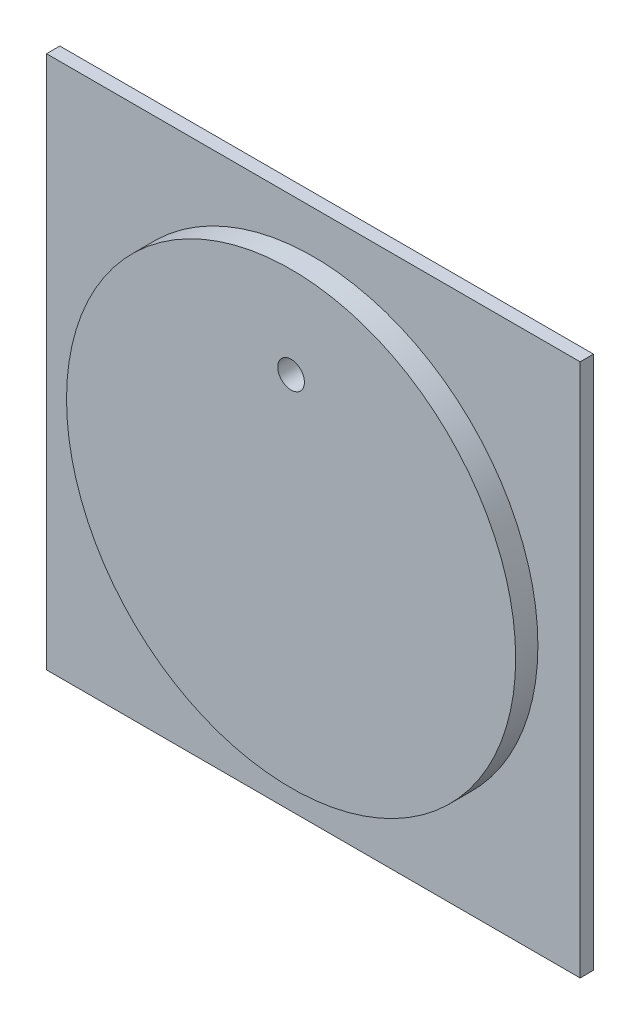
ISO-10303-21;
HEADER;
FILE_DESCRIPTION(('STEP AP214'),'2;1');
FILE_NAME('part.step','',(''),(''),'','','');
FILE_SCHEMA(('AUTOMOTIVE_DESIGN { 1 0 10303 214 1 1 1 1 }'));
ENDSEC;
DATA;
#1=APPLICATION_CONTEXT('core data for automotive mechanical design processes');
#2=APPLICATION_PROTOCOL_DEFINITION('international standard','automotive_design',2000,#1);
#3=PRODUCT_CONTEXT('',#1,'mechanical');
#4=PRODUCT('Part','Part','',(#3));
#5=PRODUCT_RELATED_PRODUCT_CATEGORY('part','',(#4));
#6=PRODUCT_DEFINITION_FORMATION('','',#4);
#7=PRODUCT_DEFINITION_CONTEXT('part definition',#1,'design');
#8=PRODUCT_DEFINITION('design','',#6,#7);
#9=PRODUCT_DEFINITION_SHAPE('','',#8);
#10=(LENGTH_UNIT() NAMED_UNIT(*) SI_UNIT(.MILLI.,.METRE.));
#11=(NAMED_UNIT(*) PLANE_ANGLE_UNIT() SI_UNIT($,.RADIAN.));
#12=(NAMED_UNIT(*) SI_UNIT($,.STERADIAN.) SOLID_ANGLE_UNIT());
#13=UNCERTAINTY_MEASURE_WITH_UNIT(LENGTH_MEASURE(1.E-05),#10,'distance_accuracy_value','');
#14=(GEOMETRIC_REPRESENTATION_CONTEXT(3) GLOBAL_UNCERTAINTY_ASSIGNED_CONTEXT((#13)) GLOBAL_UNIT_ASSIGNED_CONTEXT((#10,
#11,#12)) REPRESENTATION_CONTEXT('',''));
#15=CARTESIAN_POINT('',(0.,0.,0.));
#16=DIRECTION('',(0.,0.,1.));
#17=DIRECTION('',(1.,0.,0.));
#18=AXIS2_PLACEMENT_3D('',#15,#16,#17);
#19=CARTESIAN_POINT('',(0.,0.,4.));
#20=DIRECTION('',(0.,0.,-1.));
#21=DIRECTION('',(-1.,0.,0.));
#22=AXIS2_PLACEMENT_3D('',#19,#20,#21);
#23=CYLINDRICAL_SURFACE('',#22,25.25);
#24=CARTESIAN_POINT('',(0.,0.,1.5));
#25=DIRECTION('',(0.,0.,1.));
#26=DIRECTION('',(1.,0.,0.));
#27=AXIS2_PLACEMENT_3D('',#24,#25,#26);
#28=CIRCLE('',#27,25.25);
#29=CARTESIAN_POINT('',(25.25,0.,1.5));
#30=VERTEX_POINT('',#29);
#31=EDGE_CURVE('E127',#30,#30,#28,.T.);
#32=ORIENTED_EDGE('',*,*,#31,.T.);
#33=EDGE_LOOP('',(#32));
#34=FACE_BOUND('',#33,.T.);
#35=CARTESIAN_POINT('',(0.,0.,4.));
#36=DIRECTION('',(0.,0.,1.));
#37=DIRECTION('',(1.,0.,0.));
#38=AXIS2_PLACEMENT_3D('',#35,#36,#37);
#39=CIRCLE('',#38,25.25);
#40=CARTESIAN_POINT('',(25.25,0.,4.));
#41=VERTEX_POINT('',#40);
#42=EDGE_CURVE('E11',#41,#41,#39,.T.);
#43=ORIENTED_EDGE('',*,*,#42,.F.);
#44=EDGE_LOOP('',(#43));
#45=FACE_BOUND('',#44,.T.);
#46=ADVANCED_FACE('F43',(#34,#45),#23,.T.);
#47=CARTESIAN_POINT('',(0.,0.,4.));
#48=DIRECTION('',(0.,0.,1.));
#49=DIRECTION('',(1.,0.,0.));
#50=AXIS2_PLACEMENT_3D('',#47,#48,#49);
#51=PLANE('',#50);
#52=CARTESIAN_POINT('',(0.,15.,4.));
#53=DIRECTION('',(0.,0.,1.));
#54=DIRECTION('',(1.,0.,0.));
#55=AXIS2_PLACEMENT_3D('',#52,#53,#54);
#56=CIRCLE('',#55,1.5);
#57=CARTESIAN_POINT('',(1.50000000000002,15.,4.));
#58=VERTEX_POINT('',#57);
#59=EDGE_CURVE('E162',#58,#58,#56,.T.);
#60=ORIENTED_EDGE('',*,*,#59,.F.);
#61=EDGE_LOOP('',(#60));
#62=FACE_BOUND('',#61,.T.);
#63=ORIENTED_EDGE('',*,*,#42,.T.);
#64=EDGE_LOOP('',(#63));
#65=FACE_BOUND('',#64,.T.);
#66=ADVANCED_FACE('F146',(#62,#65),#51,.T.);
#67=CARTESIAN_POINT('',(0.,-30.,1.5));
#68=DIRECTION('',(0.,1.,0.));
#69=DIRECTION('',(0.,0.,1.));
#70=AXIS2_PLACEMENT_3D('',#67,#68,#69);
#71=PLANE('',#70);
#72=DIRECTION('',(1.,0.,0.));
#73=VECTOR('',#72,1.);
#74=CARTESIAN_POINT('',(0.,-30.,0.));
#75=LINE('',#74,#73);
#76=CARTESIAN_POINT('',(-30.,-30.,0.));
#77=VERTEX_POINT('',#76);
#78=CARTESIAN_POINT('',(30.,-30.,0.));
#79=VERTEX_POINT('',#78);
#80=EDGE_CURVE('E114',#77,#79,#75,.T.);
#81=ORIENTED_EDGE('',*,*,#80,.T.);
#82=DIRECTION('',(0.,0.,-1.));
#83=VECTOR('',#82,1.);
#84=CARTESIAN_POINT('',(30.,-30.,1.5));
#85=LINE('',#84,#83);
#86=CARTESIAN_POINT('',(30.,-30.,1.5));
#87=VERTEX_POINT('',#86);
#88=EDGE_CURVE('E52',#87,#79,#85,.T.);
#89=ORIENTED_EDGE('',*,*,#88,.F.);
#90=DIRECTION('',(1.,0.,0.));
#91=VECTOR('',#90,1.);
#92=CARTESIAN_POINT('',(0.,-30.,1.5));
#93=LINE('',#92,#91);
#94=CARTESIAN_POINT('',(-30.,-30.,1.5));
#95=VERTEX_POINT('',#94);
#96=EDGE_CURVE('E94',#95,#87,#93,.T.);
#97=ORIENTED_EDGE('',*,*,#96,.F.);
#98=DIRECTION('',(0.,0.,-1.));
#99=VECTOR('',#98,1.);
#100=CARTESIAN_POINT('',(-30.,-30.,1.5));
#101=LINE('',#100,#99);
#102=EDGE_CURVE('E60',#95,#77,#101,.T.);
#103=ORIENTED_EDGE('',*,*,#102,.T.);
#104=EDGE_LOOP('',(#81,#89,#97,#103));
#105=FACE_BOUND('',#104,.T.);
#106=ADVANCED_FACE('F132',(#105),#71,.F.);
#107=CARTESIAN_POINT('',(30.,0.,1.5));
#108=DIRECTION('',(-1.,0.,0.));
#109=DIRECTION('',(0.,0.,1.));
#110=AXIS2_PLACEMENT_3D('',#107,#108,#109);
#111=PLANE('',#110);
#112=DIRECTION('',(0.,1.,0.));
#113=VECTOR('',#112,1.);
#114=CARTESIAN_POINT('',(30.,0.,0.));
#115=LINE('',#114,#113);
#116=CARTESIAN_POINT('',(30.,30.,0.));
#117=VERTEX_POINT('',#116);
#118=EDGE_CURVE('E101',#79,#117,#115,.T.);
#119=ORIENTED_EDGE('',*,*,#118,.T.);
#120=DIRECTION('',(0.,0.,-1.));
#121=VECTOR('',#120,1.);
#122=CARTESIAN_POINT('',(30.,30.,1.5));
#123=LINE('',#122,#121);
#124=CARTESIAN_POINT('',(30.,30.,1.5));
#125=VERTEX_POINT('',#124);
#126=EDGE_CURVE('E99',#125,#117,#123,.T.);
#127=ORIENTED_EDGE('',*,*,#126,.F.);
#128=DIRECTION('',(0.,1.,0.));
#129=VECTOR('',#128,1.);
#130=CARTESIAN_POINT('',(30.,0.,1.5));
#131=LINE('',#130,#129);
#132=EDGE_CURVE('E86',#87,#125,#131,.T.);
#133=ORIENTED_EDGE('',*,*,#132,.F.);
#134=ORIENTED_EDGE('',*,*,#88,.T.);
#135=EDGE_LOOP('',(#119,#127,#133,#134));
#136=FACE_BOUND('',#135,.T.);
#137=ADVANCED_FACE('F100',(#136),#111,.F.);
#138=CARTESIAN_POINT('',(0.,30.,1.5));
#139=DIRECTION('',(0.,1.,0.));
#140=DIRECTION('',(0.,0.,1.));
#141=AXIS2_PLACEMENT_3D('',#138,#139,#140);
#142=PLANE('',#141);
#143=DIRECTION('',(1.,0.,0.));
#144=VECTOR('',#143,1.);
#145=CARTESIAN_POINT('',(0.,30.,0.));
#146=LINE('',#145,#144);
#147=CARTESIAN_POINT('',(-30.,30.,0.));
#148=VERTEX_POINT('',#147);
#149=EDGE_CURVE('E120',#148,#117,#146,.T.);
#150=ORIENTED_EDGE('',*,*,#149,.F.);
#151=DIRECTION('',(0.,0.,-1.));
#152=VECTOR('',#151,1.);
#153=CARTESIAN_POINT('',(-30.,30.,1.5));
#154=LINE('',#153,#152);
#155=CARTESIAN_POINT('',(-30.,30.,1.5));
#156=VERTEX_POINT('',#155);
#157=EDGE_CURVE('E74',#156,#148,#154,.T.);
#158=ORIENTED_EDGE('',*,*,#157,.F.);
#159=DIRECTION('',(1.,0.,0.));
#160=VECTOR('',#159,1.);
#161=CARTESIAN_POINT('',(0.,30.,1.5));
#162=LINE('',#161,#160);
#163=EDGE_CURVE('E93',#156,#125,#162,.T.);
#164=ORIENTED_EDGE('',*,*,#163,.T.);
#165=ORIENTED_EDGE('',*,*,#126,.T.);
#166=EDGE_LOOP('',(#150,#158,#164,#165));
#167=FACE_BOUND('',#166,.T.);
#168=ADVANCED_FACE('F106',(#167),#142,.T.);
#169=CARTESIAN_POINT('',(-30.,0.,1.5));
#170=DIRECTION('',(-1.,0.,0.));
#171=DIRECTION('',(0.,0.,1.));
#172=AXIS2_PLACEMENT_3D('',#169,#170,#171);
#173=PLANE('',#172);
#174=DIRECTION('',(0.,1.,0.));
#175=VECTOR('',#174,1.);
#176=CARTESIAN_POINT('',(-30.,0.,0.));
#177=LINE('',#176,#175);
#178=EDGE_CURVE('E123',#77,#148,#177,.T.);
#179=ORIENTED_EDGE('',*,*,#178,.F.);
#180=ORIENTED_EDGE('',*,*,#102,.F.);
#181=DIRECTION('',(0.,1.,0.));
#182=VECTOR('',#181,1.);
#183=CARTESIAN_POINT('',(-30.,0.,1.5));
#184=LINE('',#183,#182);
#185=EDGE_CURVE('E108',#95,#156,#184,.T.);
#186=ORIENTED_EDGE('',*,*,#185,.T.);
#187=ORIENTED_EDGE('',*,*,#157,.T.);
#188=EDGE_LOOP('',(#179,#180,#186,#187));
#189=FACE_BOUND('',#188,.T.);
#190=ADVANCED_FACE('F135',(#189),#173,.T.);
#191=CARTESIAN_POINT('',(0.,0.,1.5));
#192=DIRECTION('',(0.,0.,1.));
#193=DIRECTION('',(1.,0.,0.));
#194=AXIS2_PLACEMENT_3D('',#191,#192,#193);
#195=PLANE('',#194);
#196=ORIENTED_EDGE('',*,*,#31,.F.);
#197=EDGE_LOOP('',(#196));
#198=FACE_BOUND('',#197,.T.);
#199=ORIENTED_EDGE('',*,*,#96,.T.);
#200=ORIENTED_EDGE('',*,*,#132,.T.);
#201=ORIENTED_EDGE('',*,*,#163,.F.);
#202=ORIENTED_EDGE('',*,*,#185,.F.);
#203=EDGE_LOOP('',(#199,#200,#201,#202));
#204=FACE_BOUND('',#203,.T.);
#205=ADVANCED_FACE('F90',(#198,#204),#195,.T.);
#206=CARTESIAN_POINT('',(0.,0.,0.));
#207=DIRECTION('',(0.,0.,1.));
#208=DIRECTION('',(1.,0.,0.));
#209=AXIS2_PLACEMENT_3D('',#206,#207,#208);
#210=PLANE('',#209);
#211=CARTESIAN_POINT('',(0.,15.,0.));
#212=DIRECTION('',(0.,0.,1.));
#213=DIRECTION('',(1.,0.,0.));
#214=AXIS2_PLACEMENT_3D('',#211,#212,#213);
#215=CIRCLE('',#214,1.5);
#216=CARTESIAN_POINT('',(1.50000000000002,15.,0.));
#217=VERTEX_POINT('',#216);
#218=EDGE_CURVE('E117',#217,#217,#215,.T.);
#219=ORIENTED_EDGE('',*,*,#218,.T.);
#220=EDGE_LOOP('',(#219));
#221=FACE_BOUND('',#220,.T.);
#222=ORIENTED_EDGE('',*,*,#80,.F.);
#223=ORIENTED_EDGE('',*,*,#178,.T.);
#224=ORIENTED_EDGE('',*,*,#149,.T.);
#225=ORIENTED_EDGE('',*,*,#118,.F.);
#226=EDGE_LOOP('',(#222,#223,#224,#225));
#227=FACE_BOUND('',#226,.T.);
#228=ADVANCED_FACE('F134',(#221,#227),#210,.F.);
#229=CARTESIAN_POINT('',(0.,15.,0.));
#230=DIRECTION('',(0.,0.,1.));
#231=DIRECTION('',(1.,0.,0.));
#232=AXIS2_PLACEMENT_3D('',#229,#230,#231);
#233=CYLINDRICAL_SURFACE('',#232,1.5);
#234=ORIENTED_EDGE('',*,*,#218,.F.);
#235=EDGE_LOOP('',(#234));
#236=FACE_BOUND('',#235,.T.);
#237=ORIENTED_EDGE('',*,*,#59,.T.);
#238=EDGE_LOOP('',(#237));
#239=FACE_BOUND('',#238,.T.);
#240=ADVANCED_FACE('F171',(#236,#239),#233,.F.);
#241=CLOSED_SHELL('',(#46,#66,#106,#137,#168,#190,#205,#228,#240));
#242=MANIFOLD_SOLID_BREP('B2',#241);
#243=ADVANCED_BREP_SHAPE_REPRESENTATION('',(#18,#242),#14);
#244=SHAPE_DEFINITION_REPRESENTATION(#9,#243);
ENDSEC;
END-ISO-10303-21;
